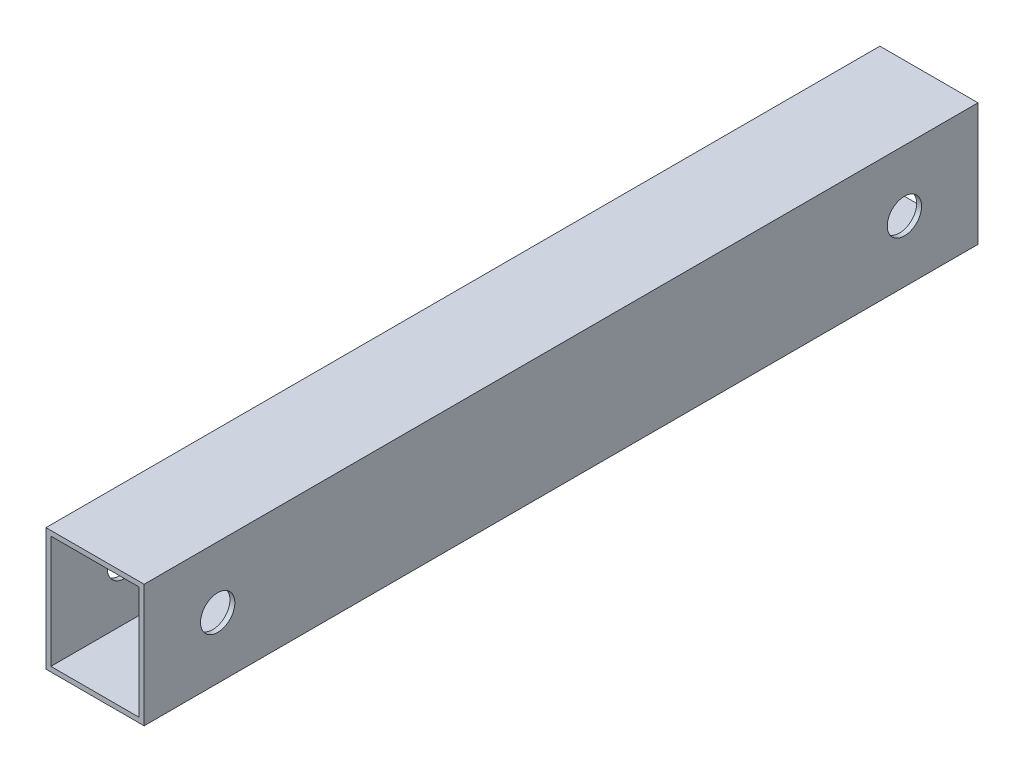
ISO-10303-21;
HEADER;
FILE_DESCRIPTION(('STEP AP214'),'2;1');
FILE_NAME('part.step','',(''),(''),'','','');
FILE_SCHEMA(('AUTOMOTIVE_DESIGN { 1 0 10303 214 1 1 1 1 }'));
ENDSEC;
DATA;
#1=APPLICATION_CONTEXT('core data for automotive mechanical design processes');
#2=APPLICATION_PROTOCOL_DEFINITION('international standard','automotive_design',2000,#1);
#3=PRODUCT_CONTEXT('',#1,'mechanical');
#4=PRODUCT('Part','Part','',(#3));
#5=PRODUCT_RELATED_PRODUCT_CATEGORY('part','',(#4));
#6=PRODUCT_DEFINITION_FORMATION('','',#4);
#7=PRODUCT_DEFINITION_CONTEXT('part definition',#1,'design');
#8=PRODUCT_DEFINITION('design','',#6,#7);
#9=PRODUCT_DEFINITION_SHAPE('','',#8);
#10=(LENGTH_UNIT() NAMED_UNIT(*) SI_UNIT(.MILLI.,.METRE.));
#11=(NAMED_UNIT(*) PLANE_ANGLE_UNIT() SI_UNIT($,.RADIAN.));
#12=(NAMED_UNIT(*) SI_UNIT($,.STERADIAN.) SOLID_ANGLE_UNIT());
#13=UNCERTAINTY_MEASURE_WITH_UNIT(LENGTH_MEASURE(1.E-05),#10,'distance_accuracy_value','');
#14=(GEOMETRIC_REPRESENTATION_CONTEXT(3) GLOBAL_UNCERTAINTY_ASSIGNED_CONTEXT((#13)) GLOBAL_UNIT_ASSIGNED_CONTEXT((#10,
#11,#12)) REPRESENTATION_CONTEXT('',''));
#15=CARTESIAN_POINT('',(0.,0.,0.));
#16=DIRECTION('',(0.,0.,1.));
#17=DIRECTION('',(1.,0.,0.));
#18=AXIS2_PLACEMENT_3D('',#15,#16,#17);
#19=CARTESIAN_POINT('',(-25.76929537247,6.42857142857143,170.));
#20=DIRECTION('',(1.,0.,0.));
#21=DIRECTION('',(0.,1.,0.));
#22=AXIS2_PLACEMENT_3D('',#19,#20,#21);
#23=PLANE('',#22);
#24=CARTESIAN_POINT('',(-25.76929537247,-6.07142857142857,155.));
#25=DIRECTION('',(-1.,0.,0.));
#26=DIRECTION('',(0.,-1.,0.));
#27=AXIS2_PLACEMENT_3D('',#24,#25,#26);
#28=CIRCLE('',#27,3.49999999999999);
#29=CARTESIAN_POINT('',(-25.76929537247,-9.57142857142856,155.));
#30=VERTEX_POINT('',#29);
#31=EDGE_CURVE('E214',#30,#30,#28,.T.);
#32=ORIENTED_EDGE('',*,*,#31,.F.);
#33=EDGE_LOOP('',(#32));
#34=FACE_BOUND('',#33,.T.);
#35=CARTESIAN_POINT('',(-25.76929537247,-6.07142857142857,15.));
#36=DIRECTION('',(-1.,0.,0.));
#37=DIRECTION('',(0.,-1.,0.));
#38=AXIS2_PLACEMENT_3D('',#35,#36,#37);
#39=CIRCLE('',#38,3.5);
#40=CARTESIAN_POINT('',(-25.76929537247,-9.57142857142857,15.));
#41=VERTEX_POINT('',#40);
#42=EDGE_CURVE('E166',#41,#41,#39,.T.);
#43=ORIENTED_EDGE('',*,*,#42,.F.);
#44=EDGE_LOOP('',(#43));
#45=FACE_BOUND('',#44,.T.);
#46=DIRECTION('',(0.,-1.,0.));
#47=VECTOR('',#46,1.);
#48=CARTESIAN_POINT('',(-25.76929537247,6.42857142857143,0.));
#49=LINE('',#48,#47);
#50=CARTESIAN_POINT('',(-25.76929537247,6.42857142857143,0.));
#51=VERTEX_POINT('',#50);
#52=CARTESIAN_POINT('',(-25.76929537247,-18.5714285714286,0.));
#53=VERTEX_POINT('',#52);
#54=EDGE_CURVE('E149',#51,#53,#49,.T.);
#55=ORIENTED_EDGE('',*,*,#54,.T.);
#56=DIRECTION('',(0.,0.,-1.));
#57=VECTOR('',#56,1.);
#58=CARTESIAN_POINT('',(-25.76929537247,-18.5714285714286,170.));
#59=LINE('',#58,#57);
#60=CARTESIAN_POINT('',(-25.76929537247,-18.5714285714286,170.));
#61=VERTEX_POINT('',#60);
#62=EDGE_CURVE('E11',#61,#53,#59,.T.);
#63=ORIENTED_EDGE('',*,*,#62,.F.);
#64=DIRECTION('',(0.,-1.,0.));
#65=VECTOR('',#64,1.);
#66=CARTESIAN_POINT('',(-25.76929537247,6.42857142857143,170.));
#67=LINE('',#66,#65);
#68=CARTESIAN_POINT('',(-25.76929537247,6.42857142857143,170.));
#69=VERTEX_POINT('',#68);
#70=EDGE_CURVE('E138',#69,#61,#67,.T.);
#71=ORIENTED_EDGE('',*,*,#70,.F.);
#72=DIRECTION('',(0.,0.,-1.));
#73=VECTOR('',#72,1.);
#74=CARTESIAN_POINT('',(-25.76929537247,6.42857142857143,170.));
#75=LINE('',#74,#73);
#76=EDGE_CURVE('E148',#69,#51,#75,.T.);
#77=ORIENTED_EDGE('',*,*,#76,.T.);
#78=EDGE_LOOP('',(#55,#63,#71,#77));
#79=FACE_BOUND('',#78,.T.);
#80=ADVANCED_FACE('F38',(#34,#45,#79),#23,.F.);
#81=CARTESIAN_POINT('',(-25.76929537247,-18.5714285714286,170.));
#82=DIRECTION('',(0.,1.,0.));
#83=DIRECTION('',(0.,0.,1.));
#84=AXIS2_PLACEMENT_3D('',#81,#82,#83);
#85=PLANE('',#84);
#86=DIRECTION('',(1.,0.,0.));
#87=VECTOR('',#86,1.);
#88=CARTESIAN_POINT('',(-25.76929537247,-18.5714285714286,0.));
#89=LINE('',#88,#87);
#90=CARTESIAN_POINT('',(-5.76929537246998,-18.5714285714286,0.));
#91=VERTEX_POINT('',#90);
#92=EDGE_CURVE('E152',#53,#91,#89,.T.);
#93=ORIENTED_EDGE('',*,*,#92,.T.);
#94=DIRECTION('',(0.,0.,-1.));
#95=VECTOR('',#94,1.);
#96=CARTESIAN_POINT('',(-5.76929537246998,-18.5714285714286,170.));
#97=LINE('',#96,#95);
#98=CARTESIAN_POINT('',(-5.76929537246998,-18.5714285714286,170.));
#99=VERTEX_POINT('',#98);
#100=EDGE_CURVE('E46',#99,#91,#97,.T.);
#101=ORIENTED_EDGE('',*,*,#100,.F.);
#102=DIRECTION('',(1.,0.,0.));
#103=VECTOR('',#102,1.);
#104=CARTESIAN_POINT('',(-25.76929537247,-18.5714285714286,170.));
#105=LINE('',#104,#103);
#106=EDGE_CURVE('E141',#61,#99,#105,.T.);
#107=ORIENTED_EDGE('',*,*,#106,.F.);
#108=ORIENTED_EDGE('',*,*,#62,.T.);
#109=EDGE_LOOP('',(#93,#101,#107,#108));
#110=FACE_BOUND('',#109,.T.);
#111=ADVANCED_FACE('F204',(#110),#85,.F.);
#112=CARTESIAN_POINT('',(-5.76929537246998,6.42857142857143,170.));
#113=DIRECTION('',(-1.,0.,0.));
#114=DIRECTION('',(0.,-1.,0.));
#115=AXIS2_PLACEMENT_3D('',#112,#113,#114);
#116=PLANE('',#115);
#117=CARTESIAN_POINT('',(-5.76929537246998,-6.07142857142856,155.));
#118=DIRECTION('',(-1.,0.,0.));
#119=DIRECTION('',(0.,-1.,0.));
#120=AXIS2_PLACEMENT_3D('',#117,#118,#119);
#121=CIRCLE('',#120,3.49999999999999);
#122=CARTESIAN_POINT('',(-5.76929537246998,-9.57142857142856,155.));
#123=VERTEX_POINT('',#122);
#124=EDGE_CURVE('E172',#123,#123,#121,.T.);
#125=ORIENTED_EDGE('',*,*,#124,.T.);
#126=EDGE_LOOP('',(#125));
#127=FACE_BOUND('',#126,.T.);
#128=CARTESIAN_POINT('',(-5.76929537246998,-6.07142857142856,15.));
#129=DIRECTION('',(-1.,0.,0.));
#130=DIRECTION('',(0.,-1.,0.));
#131=AXIS2_PLACEMENT_3D('',#128,#129,#130);
#132=CIRCLE('',#131,3.5);
#133=CARTESIAN_POINT('',(-5.76929537246998,-9.57142857142856,15.));
#134=VERTEX_POINT('',#133);
#135=EDGE_CURVE('E122',#134,#134,#132,.T.);
#136=ORIENTED_EDGE('',*,*,#135,.T.);
#137=EDGE_LOOP('',(#136));
#138=FACE_BOUND('',#137,.T.);
#139=DIRECTION('',(0.,1.,0.));
#140=VECTOR('',#139,1.);
#141=CARTESIAN_POINT('',(-5.76929537246998,6.42857142857143,0.));
#142=LINE('',#141,#140);
#143=CARTESIAN_POINT('',(-5.76929537246998,6.42857142857143,0.));
#144=VERTEX_POINT('',#143);
#145=EDGE_CURVE('E154',#91,#144,#142,.T.);
#146=ORIENTED_EDGE('',*,*,#145,.T.);
#147=DIRECTION('',(0.,0.,-1.));
#148=VECTOR('',#147,1.);
#149=CARTESIAN_POINT('',(-5.76929537246998,6.42857142857143,170.));
#150=LINE('',#149,#148);
#151=CARTESIAN_POINT('',(-5.76929537246998,6.42857142857143,170.));
#152=VERTEX_POINT('',#151);
#153=EDGE_CURVE('E159',#152,#144,#150,.T.);
#154=ORIENTED_EDGE('',*,*,#153,.F.);
#155=DIRECTION('',(0.,1.,0.));
#156=VECTOR('',#155,1.);
#157=CARTESIAN_POINT('',(-5.76929537246998,6.42857142857143,170.));
#158=LINE('',#157,#156);
#159=EDGE_CURVE('E144',#99,#152,#158,.T.);
#160=ORIENTED_EDGE('',*,*,#159,.F.);
#161=ORIENTED_EDGE('',*,*,#100,.T.);
#162=EDGE_LOOP('',(#146,#154,#160,#161));
#163=FACE_BOUND('',#162,.T.);
#164=ADVANCED_FACE('F209',(#127,#138,#163),#116,.F.);
#165=CARTESIAN_POINT('',(-25.76929537247,6.42857142857143,170.));
#166=DIRECTION('',(0.,-1.,0.));
#167=DIRECTION('',(0.,0.,-1.));
#168=AXIS2_PLACEMENT_3D('',#165,#166,#167);
#169=PLANE('',#168);
#170=DIRECTION('',(-1.,0.,0.));
#171=VECTOR('',#170,1.);
#172=CARTESIAN_POINT('',(-25.76929537247,6.42857142857143,0.));
#173=LINE('',#172,#171);
#174=EDGE_CURVE('E142',#144,#51,#173,.T.);
#175=ORIENTED_EDGE('',*,*,#174,.T.);
#176=ORIENTED_EDGE('',*,*,#76,.F.);
#177=DIRECTION('',(-1.,0.,0.));
#178=VECTOR('',#177,1.);
#179=CARTESIAN_POINT('',(-25.76929537247,6.42857142857143,170.));
#180=LINE('',#179,#178);
#181=EDGE_CURVE('E146',#152,#69,#180,.T.);
#182=ORIENTED_EDGE('',*,*,#181,.F.);
#183=ORIENTED_EDGE('',*,*,#153,.T.);
#184=EDGE_LOOP('',(#175,#176,#182,#183));
#185=FACE_BOUND('',#184,.T.);
#186=ADVANCED_FACE('F227',(#185),#169,.F.);
#187=CARTESIAN_POINT('',(0.,0.,170.));
#188=DIRECTION('',(0.,0.,1.));
#189=DIRECTION('',(1.,0.,0.));
#190=AXIS2_PLACEMENT_3D('',#187,#188,#189);
#191=PLANE('',#190);
#192=DIRECTION('',(0.,-1.,0.));
#193=VECTOR('',#192,1.);
#194=CARTESIAN_POINT('',(-24.76929537247,6.42857142857143,170.));
#195=LINE('',#194,#193);
#196=CARTESIAN_POINT('',(-24.76929537247,5.42857142857143,170.));
#197=VERTEX_POINT('',#196);
#198=CARTESIAN_POINT('',(-24.76929537247,-17.5714285714286,170.));
#199=VERTEX_POINT('',#198);
#200=EDGE_CURVE('E126',#197,#199,#195,.T.);
#201=ORIENTED_EDGE('',*,*,#200,.F.);
#202=DIRECTION('',(-1.,0.,0.));
#203=VECTOR('',#202,1.);
#204=CARTESIAN_POINT('',(-25.76929537247,5.42857142857143,170.));
#205=LINE('',#204,#203);
#206=CARTESIAN_POINT('',(-6.76929537246998,5.42857142857143,170.));
#207=VERTEX_POINT('',#206);
#208=EDGE_CURVE('E109',#207,#197,#205,.T.);
#209=ORIENTED_EDGE('',*,*,#208,.F.);
#210=DIRECTION('',(0.,1.,0.));
#211=VECTOR('',#210,1.);
#212=CARTESIAN_POINT('',(-6.76929537246998,6.42857142857143,170.));
#213=LINE('',#212,#211);
#214=CARTESIAN_POINT('',(-6.76929537246998,-17.5714285714286,170.));
#215=VERTEX_POINT('',#214);
#216=EDGE_CURVE('E135',#215,#207,#213,.T.);
#217=ORIENTED_EDGE('',*,*,#216,.F.);
#218=DIRECTION('',(1.,0.,0.));
#219=VECTOR('',#218,1.);
#220=CARTESIAN_POINT('',(-25.76929537247,-17.5714285714286,170.));
#221=LINE('',#220,#219);
#222=EDGE_CURVE('E128',#199,#215,#221,.T.);
#223=ORIENTED_EDGE('',*,*,#222,.F.);
#224=EDGE_LOOP('',(#201,#209,#217,#223));
#225=FACE_BOUND('',#224,.T.);
#226=ORIENTED_EDGE('',*,*,#70,.T.);
#227=ORIENTED_EDGE('',*,*,#106,.T.);
#228=ORIENTED_EDGE('',*,*,#159,.T.);
#229=ORIENTED_EDGE('',*,*,#181,.T.);
#230=EDGE_LOOP('',(#226,#227,#228,#229));
#231=FACE_BOUND('',#230,.T.);
#232=ADVANCED_FACE('F189',(#225,#231),#191,.T.);
#233=CARTESIAN_POINT('',(0.,0.,0.));
#234=DIRECTION('',(0.,0.,1.));
#235=DIRECTION('',(1.,0.,0.));
#236=AXIS2_PLACEMENT_3D('',#233,#234,#235);
#237=PLANE('',#236);
#238=DIRECTION('',(-1.,0.,0.));
#239=VECTOR('',#238,1.);
#240=CARTESIAN_POINT('',(-25.76929537247,5.42857142857143,0.));
#241=LINE('',#240,#239);
#242=CARTESIAN_POINT('',(-6.76929537246998,5.42857142857143,0.));
#243=VERTEX_POINT('',#242);
#244=CARTESIAN_POINT('',(-24.76929537247,5.42857142857143,0.));
#245=VERTEX_POINT('',#244);
#246=EDGE_CURVE('E107',#243,#245,#241,.T.);
#247=ORIENTED_EDGE('',*,*,#246,.T.);
#248=DIRECTION('',(0.,-1.,0.));
#249=VECTOR('',#248,1.);
#250=CARTESIAN_POINT('',(-24.76929537247,6.42857142857143,0.));
#251=LINE('',#250,#249);
#252=CARTESIAN_POINT('',(-24.76929537247,-17.5714285714286,0.));
#253=VERTEX_POINT('',#252);
#254=EDGE_CURVE('E115',#245,#253,#251,.T.);
#255=ORIENTED_EDGE('',*,*,#254,.T.);
#256=DIRECTION('',(1.,0.,0.));
#257=VECTOR('',#256,1.);
#258=CARTESIAN_POINT('',(-25.76929537247,-17.5714285714286,0.));
#259=LINE('',#258,#257);
#260=CARTESIAN_POINT('',(-6.76929537246998,-17.5714285714286,0.));
#261=VERTEX_POINT('',#260);
#262=EDGE_CURVE('E121',#253,#261,#259,.T.);
#263=ORIENTED_EDGE('',*,*,#262,.T.);
#264=DIRECTION('',(0.,1.,0.));
#265=VECTOR('',#264,1.);
#266=CARTESIAN_POINT('',(-6.76929537246998,6.42857142857143,0.));
#267=LINE('',#266,#265);
#268=EDGE_CURVE('E61',#261,#243,#267,.T.);
#269=ORIENTED_EDGE('',*,*,#268,.T.);
#270=EDGE_LOOP('',(#247,#255,#263,#269));
#271=FACE_BOUND('',#270,.T.);
#272=ORIENTED_EDGE('',*,*,#54,.F.);
#273=ORIENTED_EDGE('',*,*,#174,.F.);
#274=ORIENTED_EDGE('',*,*,#145,.F.);
#275=ORIENTED_EDGE('',*,*,#92,.F.);
#276=EDGE_LOOP('',(#272,#273,#274,#275));
#277=FACE_BOUND('',#276,.T.);
#278=ADVANCED_FACE('F124',(#271,#277),#237,.F.);
#279=CARTESIAN_POINT('',(-24.76929537247,6.42857142857143,170.));
#280=DIRECTION('',(1.,0.,0.));
#281=DIRECTION('',(0.,1.,0.));
#282=AXIS2_PLACEMENT_3D('',#279,#280,#281);
#283=PLANE('',#282);
#284=CARTESIAN_POINT('',(-24.76929537247,-6.07142857142857,155.));
#285=DIRECTION('',(1.,0.,0.));
#286=DIRECTION('',(0.,1.,0.));
#287=AXIS2_PLACEMENT_3D('',#284,#285,#286);
#288=CIRCLE('',#287,3.49999999999999);
#289=CARTESIAN_POINT('',(-24.76929537247,-2.57142857142858,155.));
#290=VERTEX_POINT('',#289);
#291=EDGE_CURVE('E177',#290,#290,#288,.T.);
#292=ORIENTED_EDGE('',*,*,#291,.F.);
#293=EDGE_LOOP('',(#292));
#294=FACE_BOUND('',#293,.T.);
#295=CARTESIAN_POINT('',(-24.76929537247,-6.07142857142857,15.));
#296=DIRECTION('',(1.,0.,0.));
#297=DIRECTION('',(0.,1.,0.));
#298=AXIS2_PLACEMENT_3D('',#295,#296,#297);
#299=CIRCLE('',#298,3.5);
#300=CARTESIAN_POINT('',(-24.76929537247,-2.57142857142857,15.));
#301=VERTEX_POINT('',#300);
#302=EDGE_CURVE('E165',#301,#301,#299,.T.);
#303=ORIENTED_EDGE('',*,*,#302,.F.);
#304=EDGE_LOOP('',(#303));
#305=FACE_BOUND('',#304,.T.);
#306=ORIENTED_EDGE('',*,*,#254,.F.);
#307=DIRECTION('',(0.,0.,-1.));
#308=VECTOR('',#307,1.);
#309=CARTESIAN_POINT('',(-24.76929537247,5.42857142857143,170.));
#310=LINE('',#309,#308);
#311=EDGE_CURVE('E103',#197,#245,#310,.T.);
#312=ORIENTED_EDGE('',*,*,#311,.F.);
#313=ORIENTED_EDGE('',*,*,#200,.T.);
#314=DIRECTION('',(0.,0.,-1.));
#315=VECTOR('',#314,1.);
#316=CARTESIAN_POINT('',(-24.76929537247,-17.5714285714286,170.));
#317=LINE('',#316,#315);
#318=EDGE_CURVE('E118',#199,#253,#317,.T.);
#319=ORIENTED_EDGE('',*,*,#318,.T.);
#320=EDGE_LOOP('',(#306,#312,#313,#319));
#321=FACE_BOUND('',#320,.T.);
#322=ADVANCED_FACE('F116',(#294,#305,#321),#283,.T.);
#323=CARTESIAN_POINT('',(-25.76929537247,-17.5714285714286,170.));
#324=DIRECTION('',(0.,1.,0.));
#325=DIRECTION('',(0.,0.,1.));
#326=AXIS2_PLACEMENT_3D('',#323,#324,#325);
#327=PLANE('',#326);
#328=ORIENTED_EDGE('',*,*,#262,.F.);
#329=ORIENTED_EDGE('',*,*,#318,.F.);
#330=ORIENTED_EDGE('',*,*,#222,.T.);
#331=DIRECTION('',(0.,0.,-1.));
#332=VECTOR('',#331,1.);
#333=CARTESIAN_POINT('',(-6.76929537246998,-17.5714285714286,170.));
#334=LINE('',#333,#332);
#335=EDGE_CURVE('E183',#215,#261,#334,.T.);
#336=ORIENTED_EDGE('',*,*,#335,.T.);
#337=EDGE_LOOP('',(#328,#329,#330,#336));
#338=FACE_BOUND('',#337,.T.);
#339=ADVANCED_FACE('F192',(#338),#327,.T.);
#340=CARTESIAN_POINT('',(-6.76929537246998,6.42857142857143,170.));
#341=DIRECTION('',(-1.,0.,0.));
#342=DIRECTION('',(0.,-1.,0.));
#343=AXIS2_PLACEMENT_3D('',#340,#341,#342);
#344=PLANE('',#343);
#345=CARTESIAN_POINT('',(-6.76929537246998,-6.07142857142856,155.));
#346=DIRECTION('',(-1.,0.,0.));
#347=DIRECTION('',(0.,-1.,0.));
#348=AXIS2_PLACEMENT_3D('',#345,#346,#347);
#349=CIRCLE('',#348,3.49999999999999);
#350=CARTESIAN_POINT('',(-6.76929537246998,-9.57142857142856,155.));
#351=VERTEX_POINT('',#350);
#352=EDGE_CURVE('E41',#351,#351,#349,.T.);
#353=ORIENTED_EDGE('',*,*,#352,.F.);
#354=EDGE_LOOP('',(#353));
#355=FACE_BOUND('',#354,.T.);
#356=CARTESIAN_POINT('',(-6.76929537246998,-6.07142857142856,15.));
#357=DIRECTION('',(-1.,0.,0.));
#358=DIRECTION('',(0.,-1.,0.));
#359=AXIS2_PLACEMENT_3D('',#356,#357,#358);
#360=CIRCLE('',#359,3.5);
#361=CARTESIAN_POINT('',(-6.76929537246998,-9.57142857142856,15.));
#362=VERTEX_POINT('',#361);
#363=EDGE_CURVE('E163',#362,#362,#360,.T.);
#364=ORIENTED_EDGE('',*,*,#363,.F.);
#365=EDGE_LOOP('',(#364));
#366=FACE_BOUND('',#365,.T.);
#367=ORIENTED_EDGE('',*,*,#268,.F.);
#368=ORIENTED_EDGE('',*,*,#335,.F.);
#369=ORIENTED_EDGE('',*,*,#216,.T.);
#370=DIRECTION('',(0.,0.,-1.));
#371=VECTOR('',#370,1.);
#372=CARTESIAN_POINT('',(-6.76929537246998,5.42857142857143,170.));
#373=LINE('',#372,#371);
#374=EDGE_CURVE('E54',#207,#243,#373,.T.);
#375=ORIENTED_EDGE('',*,*,#374,.T.);
#376=EDGE_LOOP('',(#367,#368,#369,#375));
#377=FACE_BOUND('',#376,.T.);
#378=ADVANCED_FACE('F185',(#355,#366,#377),#344,.T.);
#379=CARTESIAN_POINT('',(-25.76929537247,5.42857142857143,170.));
#380=DIRECTION('',(0.,-1.,0.));
#381=DIRECTION('',(0.,0.,-1.));
#382=AXIS2_PLACEMENT_3D('',#379,#380,#381);
#383=PLANE('',#382);
#384=ORIENTED_EDGE('',*,*,#246,.F.);
#385=ORIENTED_EDGE('',*,*,#374,.F.);
#386=ORIENTED_EDGE('',*,*,#208,.T.);
#387=ORIENTED_EDGE('',*,*,#311,.T.);
#388=EDGE_LOOP('',(#384,#385,#386,#387));
#389=FACE_BOUND('',#388,.T.);
#390=ADVANCED_FACE('F105',(#389),#383,.T.);
#391=CARTESIAN_POINT('',(144.23070462753,-6.07142857142852,15.));
#392=DIRECTION('',(-1.,0.,0.));
#393=DIRECTION('',(0.,-1.,0.));
#394=AXIS2_PLACEMENT_3D('',#391,#392,#393);
#395=CYLINDRICAL_SURFACE('',#394,3.5);
#396=ORIENTED_EDGE('',*,*,#363,.T.);
#397=EDGE_LOOP('',(#396));
#398=FACE_BOUND('',#397,.T.);
#399=ORIENTED_EDGE('',*,*,#135,.F.);
#400=EDGE_LOOP('',(#399));
#401=FACE_BOUND('',#400,.T.);
#402=ADVANCED_FACE('F243',(#398,#401),#395,.F.);
#403=ORIENTED_EDGE('',*,*,#302,.T.);
#404=EDGE_LOOP('',(#403));
#405=FACE_BOUND('',#404,.T.);
#406=ORIENTED_EDGE('',*,*,#42,.T.);
#407=EDGE_LOOP('',(#406));
#408=FACE_BOUND('',#407,.T.);
#409=ADVANCED_FACE('F247',(#405,#408),#395,.F.);
#410=CARTESIAN_POINT('',(144.23070462753,-6.07142857142852,155.));
#411=DIRECTION('',(-1.,0.,0.));
#412=DIRECTION('',(0.,-1.,0.));
#413=AXIS2_PLACEMENT_3D('',#410,#411,#412);
#414=CYLINDRICAL_SURFACE('',#413,3.49999999999999);
#415=ORIENTED_EDGE('',*,*,#352,.T.);
#416=EDGE_LOOP('',(#415));
#417=FACE_BOUND('',#416,.T.);
#418=ORIENTED_EDGE('',*,*,#124,.F.);
#419=EDGE_LOOP('',(#418));
#420=FACE_BOUND('',#419,.T.);
#421=ADVANCED_FACE('F252',(#417,#420),#414,.F.);
#422=ORIENTED_EDGE('',*,*,#291,.T.);
#423=EDGE_LOOP('',(#422));
#424=FACE_BOUND('',#423,.T.);
#425=ORIENTED_EDGE('',*,*,#31,.T.);
#426=EDGE_LOOP('',(#425));
#427=FACE_BOUND('',#426,.T.);
#428=ADVANCED_FACE('F257',(#424,#427),#414,.F.);
#429=CLOSED_SHELL('',(#80,#111,#164,#186,#232,#278,#322,#339,#378,#390,#402,#409,#421,#428));
#430=MANIFOLD_SOLID_BREP('B2',#429);
#431=ADVANCED_BREP_SHAPE_REPRESENTATION('',(#18,#430),#14);
#432=SHAPE_DEFINITION_REPRESENTATION(#9,#431);
ENDSEC;
END-ISO-10303-21;
